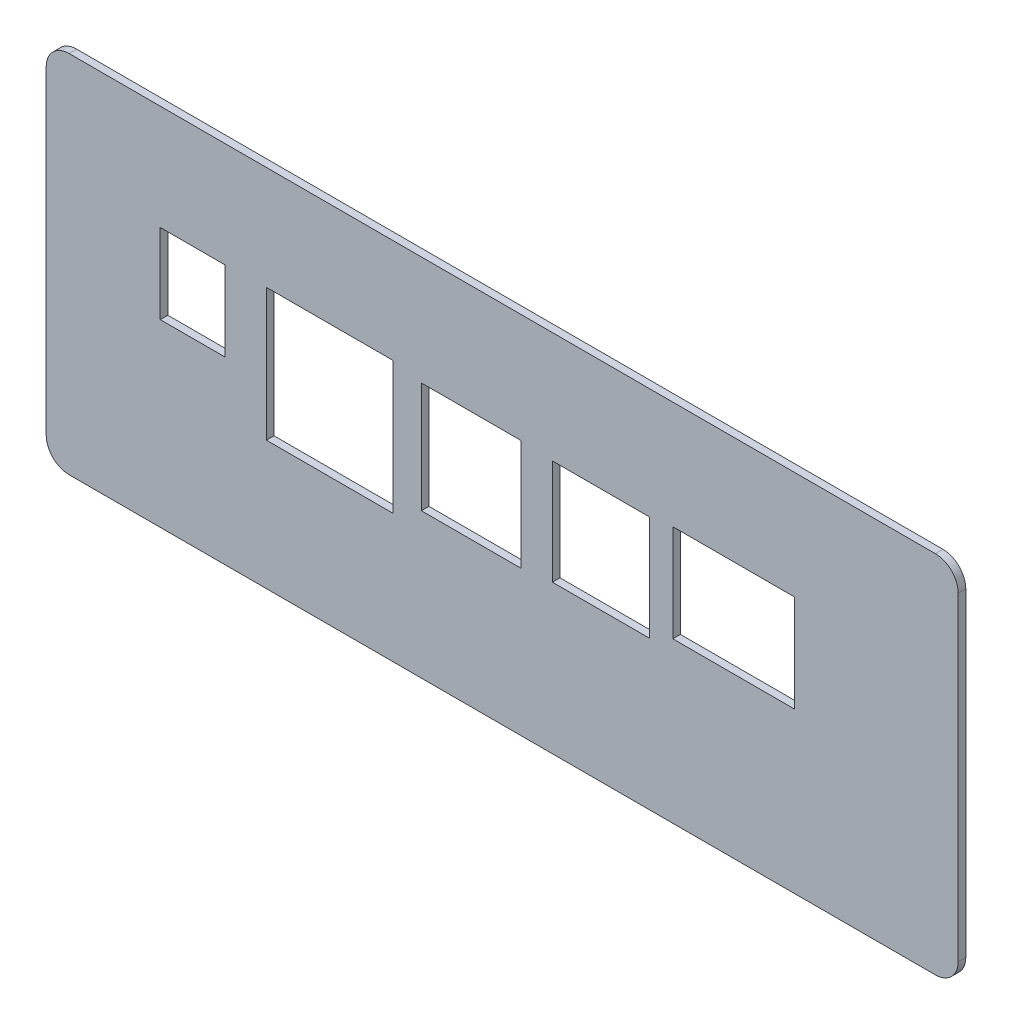
ISO-10303-21;
HEADER;
FILE_DESCRIPTION(('STEP AP214'),'2;1');
FILE_NAME('part.step','',(''),(''),'','','');
FILE_SCHEMA(('AUTOMOTIVE_DESIGN { 1 0 10303 214 1 1 1 1 }'));
ENDSEC;
DATA;
#1=APPLICATION_CONTEXT('core data for automotive mechanical design processes');
#2=APPLICATION_PROTOCOL_DEFINITION('international standard','automotive_design',2000,#1);
#3=PRODUCT_CONTEXT('',#1,'mechanical');
#4=PRODUCT('Part','Part','',(#3));
#5=PRODUCT_RELATED_PRODUCT_CATEGORY('part','',(#4));
#6=PRODUCT_DEFINITION_FORMATION('','',#4);
#7=PRODUCT_DEFINITION_CONTEXT('part definition',#1,'design');
#8=PRODUCT_DEFINITION('design','',#6,#7);
#9=PRODUCT_DEFINITION_SHAPE('','',#8);
#10=(LENGTH_UNIT() NAMED_UNIT(*) SI_UNIT(.MILLI.,.METRE.));
#11=(NAMED_UNIT(*) PLANE_ANGLE_UNIT() SI_UNIT($,.RADIAN.));
#12=(NAMED_UNIT(*) SI_UNIT($,.STERADIAN.) SOLID_ANGLE_UNIT());
#13=UNCERTAINTY_MEASURE_WITH_UNIT(LENGTH_MEASURE(1.E-05),#10,'distance_accuracy_value','');
#14=(GEOMETRIC_REPRESENTATION_CONTEXT(3) GLOBAL_UNCERTAINTY_ASSIGNED_CONTEXT((#13)) GLOBAL_UNIT_ASSIGNED_CONTEXT((#10,
#11,#12)) REPRESENTATION_CONTEXT('',''));
#15=CARTESIAN_POINT('',(0.,0.,0.));
#16=DIRECTION('',(0.,0.,1.));
#17=DIRECTION('',(1.,0.,0.));
#18=AXIS2_PLACEMENT_3D('',#15,#16,#17);
#19=CARTESIAN_POINT('',(-51.9401445531972,-20.8055695293981,1.));
#20=DIRECTION('',(0.,0.,1.));
#21=DIRECTION('',(1.,0.,0.));
#22=AXIS2_PLACEMENT_3D('',#19,#20,#21);
#23=PLANE('',#22);
#24=CARTESIAN_POINT('',(-51.9401445531972,-20.8055695293981,1.));
#25=DIRECTION('',(0.,0.,1.));
#26=DIRECTION('',(1.,0.,0.));
#27=AXIS2_PLACEMENT_3D('',#24,#25,#26);
#28=CIRCLE('',#27,3.);
#29=CARTESIAN_POINT('',(-54.9401445531972,-20.8055695293981,1.));
#30=VERTEX_POINT('',#29);
#31=CARTESIAN_POINT('',(-51.9401445531972,-23.8055695293981,1.));
#32=VERTEX_POINT('',#31);
#33=EDGE_CURVE('E380',#30,#32,#28,.T.);
#34=ORIENTED_EDGE('',*,*,#33,.T.);
#35=DIRECTION('',(1.,0.,0.));
#36=VECTOR('',#35,1.);
#37=CARTESIAN_POINT('',(-51.9401445531972,-23.8055695293981,1.));
#38=LINE('',#37,#36);
#39=CARTESIAN_POINT('',(62.0598554468028,-23.8055695293981,1.));
#40=VERTEX_POINT('',#39);
#41=EDGE_CURVE('E383',#32,#40,#38,.T.);
#42=ORIENTED_EDGE('',*,*,#41,.T.);
#43=CARTESIAN_POINT('',(62.0598554468028,-20.8055695293981,1.));
#44=DIRECTION('',(0.,0.,1.));
#45=DIRECTION('',(1.,0.,0.));
#46=AXIS2_PLACEMENT_3D('',#43,#44,#45);
#47=CIRCLE('',#46,3.);
#48=CARTESIAN_POINT('',(65.0598554468028,-20.8055695293981,1.));
#49=VERTEX_POINT('',#48);
#50=EDGE_CURVE('E386',#40,#49,#47,.T.);
#51=ORIENTED_EDGE('',*,*,#50,.T.);
#52=DIRECTION('',(0.,1.,0.));
#53=VECTOR('',#52,1.);
#54=CARTESIAN_POINT('',(65.0598554468028,-20.8055695293981,1.));
#55=LINE('',#54,#53);
#56=CARTESIAN_POINT('',(65.0598554468028,21.1944304706019,1.));
#57=VERTEX_POINT('',#56);
#58=EDGE_CURVE('E388',#49,#57,#55,.T.);
#59=ORIENTED_EDGE('',*,*,#58,.T.);
#60=CARTESIAN_POINT('',(62.0598554468028,21.1944304706019,1.));
#61=DIRECTION('',(0.,0.,1.));
#62=DIRECTION('',(1.,0.,0.));
#63=AXIS2_PLACEMENT_3D('',#60,#61,#62);
#64=CIRCLE('',#63,3.);
#65=CARTESIAN_POINT('',(62.0598554468028,24.1944304706019,1.));
#66=VERTEX_POINT('',#65);
#67=EDGE_CURVE('E390',#57,#66,#64,.T.);
#68=ORIENTED_EDGE('',*,*,#67,.T.);
#69=DIRECTION('',(-1.,0.,0.));
#70=VECTOR('',#69,1.);
#71=CARTESIAN_POINT('',(62.0598554468028,24.1944304706019,1.));
#72=LINE('',#71,#70);
#73=CARTESIAN_POINT('',(-51.9401445531972,24.1944304706019,1.));
#74=VERTEX_POINT('',#73);
#75=EDGE_CURVE('E392',#66,#74,#72,.T.);
#76=ORIENTED_EDGE('',*,*,#75,.T.);
#77=CARTESIAN_POINT('',(-51.9401445531972,21.1944304706019,1.));
#78=DIRECTION('',(0.,0.,1.));
#79=DIRECTION('',(1.,0.,0.));
#80=AXIS2_PLACEMENT_3D('',#77,#78,#79);
#81=CIRCLE('',#80,3.);
#82=CARTESIAN_POINT('',(-54.9401445531972,21.1944304706019,1.));
#83=VERTEX_POINT('',#82);
#84=EDGE_CURVE('E394',#74,#83,#81,.T.);
#85=ORIENTED_EDGE('',*,*,#84,.T.);
#86=DIRECTION('',(0.,-1.,0.));
#87=VECTOR('',#86,1.);
#88=CARTESIAN_POINT('',(-54.9401445531972,21.1944304706019,1.));
#89=LINE('',#88,#87);
#90=EDGE_CURVE('E396',#83,#30,#89,.T.);
#91=ORIENTED_EDGE('',*,*,#90,.T.);
#92=EDGE_LOOP('',(#34,#42,#51,#59,#68,#76,#85,#91));
#93=FACE_BOUND('',#92,.T.);
#94=DIRECTION('',(1.,0.,0.));
#95=VECTOR('',#94,1.);
#96=CARTESIAN_POINT('',(-5.58234423291933,-4.72872628174269,1.));
#97=LINE('',#96,#95);
#98=CARTESIAN_POINT('',(-5.58234423291933,-4.72872628174269,1.));
#99=VERTEX_POINT('',#98);
#100=CARTESIAN_POINT('',(7.51913348173285,-4.72872628174269,1.));
#101=VERTEX_POINT('',#100);
#102=EDGE_CURVE('E351',#99,#101,#97,.T.);
#103=ORIENTED_EDGE('',*,*,#102,.F.);
#104=DIRECTION('',(0.,-1.,0.));
#105=VECTOR('',#104,1.);
#106=CARTESIAN_POINT('',(-5.58234423291933,9.82946846077716,1.));
#107=LINE('',#106,#105);
#108=CARTESIAN_POINT('',(-5.58234423291933,9.82946846077716,1.));
#109=VERTEX_POINT('',#108);
#110=EDGE_CURVE('E349',#109,#99,#107,.T.);
#111=ORIENTED_EDGE('',*,*,#110,.F.);
#112=DIRECTION('',(-1.,0.,0.));
#113=VECTOR('',#112,1.);
#114=CARTESIAN_POINT('',(7.51913348173285,9.82946846077716,1.));
#115=LINE('',#114,#113);
#116=CARTESIAN_POINT('',(7.51913348173285,9.82946846077716,1.));
#117=VERTEX_POINT('',#116);
#118=EDGE_CURVE('E357',#117,#109,#115,.T.);
#119=ORIENTED_EDGE('',*,*,#118,.F.);
#120=DIRECTION('',(0.,1.,0.));
#121=VECTOR('',#120,1.);
#122=CARTESIAN_POINT('',(7.51913348173285,-4.72872628174269,1.));
#123=LINE('',#122,#121);
#124=EDGE_CURVE('E354',#101,#117,#123,.T.);
#125=ORIENTED_EDGE('',*,*,#124,.F.);
#126=EDGE_LOOP('',(#103,#111,#119,#125));
#127=FACE_BOUND('',#126,.T.);
#128=DIRECTION('',(0.,1.,0.));
#129=VECTOR('',#128,1.);
#130=CARTESIAN_POINT('',(-31.4401445531972,-0.130569529398064,1.));
#131=LINE('',#130,#129);
#132=CARTESIAN_POINT('',(-31.4401445531972,-0.130569529398064,1.));
#133=VERTEX_POINT('',#132);
#134=CARTESIAN_POINT('',(-31.4401445531972,10.3694304706019,1.));
#135=VERTEX_POINT('',#134);
#136=EDGE_CURVE('E320',#133,#135,#131,.T.);
#137=ORIENTED_EDGE('',*,*,#136,.F.);
#138=DIRECTION('',(1.,0.,0.));
#139=VECTOR('',#138,1.);
#140=CARTESIAN_POINT('',(-39.9401445531972,-0.130569529398064,1.));
#141=LINE('',#140,#139);
#142=CARTESIAN_POINT('',(-39.9401445531972,-0.130569529398064,1.));
#143=VERTEX_POINT('',#142);
#144=EDGE_CURVE('E318',#143,#133,#141,.T.);
#145=ORIENTED_EDGE('',*,*,#144,.F.);
#146=DIRECTION('',(0.,-1.,0.));
#147=VECTOR('',#146,1.);
#148=CARTESIAN_POINT('',(-39.9401445531972,10.3694304706019,1.));
#149=LINE('',#148,#147);
#150=CARTESIAN_POINT('',(-39.9401445531972,10.3694304706019,1.));
#151=VERTEX_POINT('',#150);
#152=EDGE_CURVE('E326',#151,#143,#149,.T.);
#153=ORIENTED_EDGE('',*,*,#152,.F.);
#154=DIRECTION('',(-1.,0.,0.));
#155=VECTOR('',#154,1.);
#156=CARTESIAN_POINT('',(-31.4401445531972,10.3694304706019,1.));
#157=LINE('',#156,#155);
#158=EDGE_CURVE('E323',#135,#151,#157,.T.);
#159=ORIENTED_EDGE('',*,*,#158,.F.);
#160=EDGE_LOOP('',(#137,#145,#153,#159));
#161=FACE_BOUND('',#160,.T.);
#162=DIRECTION('',(1.,0.,0.));
#163=VECTOR('',#162,1.);
#164=CARTESIAN_POINT('',(-25.9690040468462,-6.88508743177806,1.));
#165=LINE('',#164,#163);
#166=CARTESIAN_POINT('',(-25.9690040468462,-6.88508743177806,1.));
#167=VERTEX_POINT('',#166);
#168=CARTESIAN_POINT('',(-9.29014455319717,-6.88508743177806,1.));
#169=VERTEX_POINT('',#168);
#170=EDGE_CURVE('E289',#167,#169,#165,.T.);
#171=ORIENTED_EDGE('',*,*,#170,.F.);
#172=DIRECTION('',(0.,-1.,0.));
#173=VECTOR('',#172,1.);
#174=CARTESIAN_POINT('',(-25.9690040468462,10.5332304706019,1.));
#175=LINE('',#174,#173);
#176=CARTESIAN_POINT('',(-25.9690040468462,10.5332304706019,1.));
#177=VERTEX_POINT('',#176);
#178=EDGE_CURVE('E287',#177,#167,#175,.T.);
#179=ORIENTED_EDGE('',*,*,#178,.F.);
#180=DIRECTION('',(-1.,0.,0.));
#181=VECTOR('',#180,1.);
#182=CARTESIAN_POINT('',(-9.29014455319717,10.5332304706019,1.));
#183=LINE('',#182,#181);
#184=CARTESIAN_POINT('',(-9.29014455319717,10.5332304706019,1.));
#185=VERTEX_POINT('',#184);
#186=EDGE_CURVE('E295',#185,#177,#183,.T.);
#187=ORIENTED_EDGE('',*,*,#186,.F.);
#188=DIRECTION('',(0.,1.,0.));
#189=VECTOR('',#188,1.);
#190=CARTESIAN_POINT('',(-9.29014455319717,-6.88508743177806,1.));
#191=LINE('',#190,#189);
#192=EDGE_CURVE('E292',#169,#185,#191,.T.);
#193=ORIENTED_EDGE('',*,*,#192,.F.);
#194=EDGE_LOOP('',(#171,#179,#187,#193));
#195=FACE_BOUND('',#194,.T.);
#196=DIRECTION('',(1.,0.,0.));
#197=VECTOR('',#196,1.);
#198=CARTESIAN_POINT('',(27.5098555623345,-2.78056952939806,1.));
#199=LINE('',#198,#197);
#200=CARTESIAN_POINT('',(27.5098555623345,-2.78056952939806,1.));
#201=VERTEX_POINT('',#200);
#202=CARTESIAN_POINT('',(43.5050701768028,-2.78056952939806,1.));
#203=VERTEX_POINT('',#202);
#204=EDGE_CURVE('E258',#201,#203,#199,.T.);
#205=ORIENTED_EDGE('',*,*,#204,.F.);
#206=DIRECTION('',(0.,-1.,0.));
#207=VECTOR('',#206,1.);
#208=CARTESIAN_POINT('',(27.5098555623345,9.99323047060194,1.));
#209=LINE('',#208,#207);
#210=CARTESIAN_POINT('',(27.5098555623345,9.99323047060194,1.));
#211=VERTEX_POINT('',#210);
#212=EDGE_CURVE('E256',#211,#201,#209,.T.);
#213=ORIENTED_EDGE('',*,*,#212,.F.);
#214=DIRECTION('',(-1.,0.,0.));
#215=VECTOR('',#214,1.);
#216=CARTESIAN_POINT('',(43.5050701768028,9.99323047060194,1.));
#217=LINE('',#216,#215);
#218=CARTESIAN_POINT('',(43.5050701768028,9.99323047060194,1.));
#219=VERTEX_POINT('',#218);
#220=EDGE_CURVE('E264',#219,#211,#217,.T.);
#221=ORIENTED_EDGE('',*,*,#220,.F.);
#222=DIRECTION('',(0.,1.,0.));
#223=VECTOR('',#222,1.);
#224=CARTESIAN_POINT('',(43.5050701768028,-2.78056952939806,1.));
#225=LINE('',#224,#223);
#226=EDGE_CURVE('E261',#203,#219,#225,.T.);
#227=ORIENTED_EDGE('',*,*,#226,.F.);
#228=EDGE_LOOP('',(#205,#213,#221,#227));
#229=FACE_BOUND('',#228,.T.);
#230=DIRECTION('',(1.,0.,0.));
#231=VECTOR('',#230,1.);
#232=CARTESIAN_POINT('',(11.6598554468024,-4.25056952939696,1.));
#233=LINE('',#232,#231);
#234=CARTESIAN_POINT('',(11.6598554468024,-4.25056952939696,1.));
#235=VERTEX_POINT('',#234);
#236=CARTESIAN_POINT('',(24.4598554468021,-4.25056952939696,1.));
#237=VERTEX_POINT('',#236);
#238=EDGE_CURVE('E228',#235,#237,#233,.T.);
#239=ORIENTED_EDGE('',*,*,#238,.F.);
#240=DIRECTION('',(0.,-1.,0.));
#241=VECTOR('',#240,1.);
#242=CARTESIAN_POINT('',(11.6598554468024,9.56943047065491,1.));
#243=LINE('',#242,#241);
#244=CARTESIAN_POINT('',(11.6598554468024,9.56943047065491,1.));
#245=VERTEX_POINT('',#244);
#246=EDGE_CURVE('E220',#245,#235,#243,.T.);
#247=ORIENTED_EDGE('',*,*,#246,.F.);
#248=DIRECTION('',(-1.,0.,0.));
#249=VECTOR('',#248,1.);
#250=CARTESIAN_POINT('',(24.4598554468021,9.56943047065491,1.));
#251=LINE('',#250,#249);
#252=CARTESIAN_POINT('',(24.4598554468021,9.56943047065491,1.));
#253=VERTEX_POINT('',#252);
#254=EDGE_CURVE('E242',#253,#245,#251,.T.);
#255=ORIENTED_EDGE('',*,*,#254,.F.);
#256=DIRECTION('',(0.,1.,0.));
#257=VECTOR('',#256,1.);
#258=CARTESIAN_POINT('',(24.4598554468021,-4.25056952939696,1.));
#259=LINE('',#258,#257);
#260=EDGE_CURVE('E240',#237,#253,#259,.T.);
#261=ORIENTED_EDGE('',*,*,#260,.F.);
#262=EDGE_LOOP('',(#239,#247,#255,#261));
#263=FACE_BOUND('',#262,.T.);
#264=ADVANCED_FACE('F35',(#93,#127,#161,#195,#229,#263),#23,.T.);
#265=CARTESIAN_POINT('',(-51.9401445531972,-20.8055695293981,0.));
#266=DIRECTION('',(0.,0.,1.));
#267=DIRECTION('',(1.,0.,0.));
#268=AXIS2_PLACEMENT_3D('',#265,#266,#267);
#269=PLANE('',#268);
#270=DIRECTION('',(0.,-1.,0.));
#271=VECTOR('',#270,1.);
#272=CARTESIAN_POINT('',(27.5098555623345,9.99323047060194,0.));
#273=LINE('',#272,#271);
#274=CARTESIAN_POINT('',(27.5098555623345,9.99323047060194,0.));
#275=VERTEX_POINT('',#274);
#276=CARTESIAN_POINT('',(27.5098555623345,-2.78056952939806,0.));
#277=VERTEX_POINT('',#276);
#278=EDGE_CURVE('E236',#275,#277,#273,.T.);
#279=ORIENTED_EDGE('',*,*,#278,.T.);
#280=DIRECTION('',(1.,0.,0.));
#281=VECTOR('',#280,1.);
#282=CARTESIAN_POINT('',(27.5098555623345,-2.78056952939806,0.));
#283=LINE('',#282,#281);
#284=CARTESIAN_POINT('',(43.5050701768028,-2.78056952939806,0.));
#285=VERTEX_POINT('',#284);
#286=EDGE_CURVE('E269',#277,#285,#283,.T.);
#287=ORIENTED_EDGE('',*,*,#286,.T.);
#288=DIRECTION('',(0.,1.,0.));
#289=VECTOR('',#288,1.);
#290=CARTESIAN_POINT('',(43.5050701768028,-2.78056952939806,0.));
#291=LINE('',#290,#289);
#292=CARTESIAN_POINT('',(43.5050701768028,9.99323047060194,0.));
#293=VERTEX_POINT('',#292);
#294=EDGE_CURVE('E272',#285,#293,#291,.T.);
#295=ORIENTED_EDGE('',*,*,#294,.T.);
#296=DIRECTION('',(-1.,0.,0.));
#297=VECTOR('',#296,1.);
#298=CARTESIAN_POINT('',(43.5050701768028,9.99323047060194,0.));
#299=LINE('',#298,#297);
#300=EDGE_CURVE('E259',#293,#275,#299,.T.);
#301=ORIENTED_EDGE('',*,*,#300,.T.);
#302=EDGE_LOOP('',(#279,#287,#295,#301));
#303=FACE_BOUND('',#302,.T.);
#304=DIRECTION('',(1.,0.,0.));
#305=VECTOR('',#304,1.);
#306=CARTESIAN_POINT('',(-39.9401445531972,-0.130569529398064,0.));
#307=LINE('',#306,#305);
#308=CARTESIAN_POINT('',(-39.9401445531972,-0.130569529398064,0.));
#309=VERTEX_POINT('',#308);
#310=CARTESIAN_POINT('',(-31.4401445531972,-0.130569529398064,0.));
#311=VERTEX_POINT('',#310);
#312=EDGE_CURVE('E317',#309,#311,#307,.T.);
#313=ORIENTED_EDGE('',*,*,#312,.T.);
#314=DIRECTION('',(0.,1.,0.));
#315=VECTOR('',#314,1.);
#316=CARTESIAN_POINT('',(-31.4401445531972,-0.130569529398064,0.));
#317=LINE('',#316,#315);
#318=CARTESIAN_POINT('',(-31.4401445531972,10.3694304706019,0.));
#319=VERTEX_POINT('',#318);
#320=EDGE_CURVE('E331',#311,#319,#317,.T.);
#321=ORIENTED_EDGE('',*,*,#320,.T.);
#322=DIRECTION('',(-1.,0.,0.));
#323=VECTOR('',#322,1.);
#324=CARTESIAN_POINT('',(-31.4401445531972,10.3694304706019,0.));
#325=LINE('',#324,#323);
#326=CARTESIAN_POINT('',(-39.9401445531972,10.3694304706019,0.));
#327=VERTEX_POINT('',#326);
#328=EDGE_CURVE('E334',#319,#327,#325,.T.);
#329=ORIENTED_EDGE('',*,*,#328,.T.);
#330=DIRECTION('',(0.,-1.,0.));
#331=VECTOR('',#330,1.);
#332=CARTESIAN_POINT('',(-39.9401445531972,10.3694304706019,0.));
#333=LINE('',#332,#331);
#334=EDGE_CURVE('E321',#327,#309,#333,.T.);
#335=ORIENTED_EDGE('',*,*,#334,.T.);
#336=EDGE_LOOP('',(#313,#321,#329,#335));
#337=FACE_BOUND('',#336,.T.);
#338=CARTESIAN_POINT('',(-51.9401445531972,-20.8055695293981,0.));
#339=DIRECTION('',(0.,0.,1.));
#340=DIRECTION('',(1.,0.,0.));
#341=AXIS2_PLACEMENT_3D('',#338,#339,#340);
#342=CIRCLE('',#341,3.);
#343=CARTESIAN_POINT('',(-54.9401445531972,-20.8055695293981,0.));
#344=VERTEX_POINT('',#343);
#345=CARTESIAN_POINT('',(-51.9401445531972,-23.8055695293981,0.));
#346=VERTEX_POINT('',#345);
#347=EDGE_CURVE('E379',#344,#346,#342,.T.);
#348=ORIENTED_EDGE('',*,*,#347,.F.);
#349=DIRECTION('',(0.,-1.,0.));
#350=VECTOR('',#349,1.);
#351=CARTESIAN_POINT('',(-54.9401445531972,0.194430470601938,0.));
#352=LINE('',#351,#350);
#353=CARTESIAN_POINT('',(-54.9401445531972,21.1944304706019,0.));
#354=VERTEX_POINT('',#353);
#355=EDGE_CURVE('E384',#354,#344,#352,.T.);
#356=ORIENTED_EDGE('',*,*,#355,.F.);
#357=CARTESIAN_POINT('',(-51.9401445531972,21.1944304706019,0.));
#358=DIRECTION('',(0.,0.,1.));
#359=DIRECTION('',(1.,0.,0.));
#360=AXIS2_PLACEMENT_3D('',#357,#358,#359);
#361=CIRCLE('',#360,3.);
#362=CARTESIAN_POINT('',(-51.9401445531972,24.1944304706019,0.));
#363=VERTEX_POINT('',#362);
#364=EDGE_CURVE('E412',#363,#354,#361,.T.);
#365=ORIENTED_EDGE('',*,*,#364,.F.);
#366=DIRECTION('',(-1.,0.,0.));
#367=VECTOR('',#366,1.);
#368=CARTESIAN_POINT('',(62.0598554468028,24.1944304706019,0.));
#369=LINE('',#368,#367);
#370=CARTESIAN_POINT('',(62.0598554468028,24.1944304706019,0.));
#371=VERTEX_POINT('',#370);
#372=EDGE_CURVE('E410',#371,#363,#369,.T.);
#373=ORIENTED_EDGE('',*,*,#372,.F.);
#374=CARTESIAN_POINT('',(62.0598554468028,21.1944304706019,0.));
#375=DIRECTION('',(0.,0.,1.));
#376=DIRECTION('',(1.,0.,0.));
#377=AXIS2_PLACEMENT_3D('',#374,#375,#376);
#378=CIRCLE('',#377,3.);
#379=CARTESIAN_POINT('',(65.0598554468028,21.1944304706019,0.));
#380=VERTEX_POINT('',#379);
#381=EDGE_CURVE('E408',#380,#371,#378,.T.);
#382=ORIENTED_EDGE('',*,*,#381,.F.);
#383=DIRECTION('',(0.,1.,0.));
#384=VECTOR('',#383,1.);
#385=CARTESIAN_POINT('',(65.0598554468031,0.194430470601938,0.));
#386=LINE('',#385,#384);
#387=CARTESIAN_POINT('',(65.0598554468028,-20.8055695293981,0.));
#388=VERTEX_POINT('',#387);
#389=EDGE_CURVE('E406',#388,#380,#386,.T.);
#390=ORIENTED_EDGE('',*,*,#389,.F.);
#391=CARTESIAN_POINT('',(62.0598554468028,-20.8055695293981,0.));
#392=DIRECTION('',(0.,0.,1.));
#393=DIRECTION('',(1.,0.,0.));
#394=AXIS2_PLACEMENT_3D('',#391,#392,#393);
#395=CIRCLE('',#394,3.);
#396=CARTESIAN_POINT('',(62.0598554468028,-23.8055695293981,0.));
#397=VERTEX_POINT('',#396);
#398=EDGE_CURVE('E403',#397,#388,#395,.T.);
#399=ORIENTED_EDGE('',*,*,#398,.F.);
#400=DIRECTION('',(1.,0.,0.));
#401=VECTOR('',#400,1.);
#402=CARTESIAN_POINT('',(-51.9401445531972,-23.8055695293981,0.));
#403=LINE('',#402,#401);
#404=EDGE_CURVE('E401',#346,#397,#403,.T.);
#405=ORIENTED_EDGE('',*,*,#404,.F.);
#406=EDGE_LOOP('',(#348,#356,#365,#373,#382,#390,#399,#405));
#407=FACE_BOUND('',#406,.T.);
#408=DIRECTION('',(0.,-1.,0.));
#409=VECTOR('',#408,1.);
#410=CARTESIAN_POINT('',(-5.58234423291933,9.82946846077716,0.));
#411=LINE('',#410,#409);
#412=CARTESIAN_POINT('',(-5.58234423291933,9.82946846077716,0.));
#413=VERTEX_POINT('',#412);
#414=CARTESIAN_POINT('',(-5.58234423291933,-4.72872628174269,0.));
#415=VERTEX_POINT('',#414);
#416=EDGE_CURVE('E348',#413,#415,#411,.T.);
#417=ORIENTED_EDGE('',*,*,#416,.T.);
#418=DIRECTION('',(1.,0.,0.));
#419=VECTOR('',#418,1.);
#420=CARTESIAN_POINT('',(-5.58234423291933,-4.72872628174269,0.));
#421=LINE('',#420,#419);
#422=CARTESIAN_POINT('',(7.51913348173285,-4.72872628174269,0.));
#423=VERTEX_POINT('',#422);
#424=EDGE_CURVE('E362',#415,#423,#421,.T.);
#425=ORIENTED_EDGE('',*,*,#424,.T.);
#426=DIRECTION('',(0.,1.,0.));
#427=VECTOR('',#426,1.);
#428=CARTESIAN_POINT('',(7.51913348173285,-4.72872628174269,0.));
#429=LINE('',#428,#427);
#430=CARTESIAN_POINT('',(7.51913348173285,9.82946846077716,0.));
#431=VERTEX_POINT('',#430);
#432=EDGE_CURVE('E365',#423,#431,#429,.T.);
#433=ORIENTED_EDGE('',*,*,#432,.T.);
#434=DIRECTION('',(-1.,0.,0.));
#435=VECTOR('',#434,1.);
#436=CARTESIAN_POINT('',(7.51913348173285,9.82946846077716,0.));
#437=LINE('',#436,#435);
#438=EDGE_CURVE('E352',#431,#413,#437,.T.);
#439=ORIENTED_EDGE('',*,*,#438,.T.);
#440=EDGE_LOOP('',(#417,#425,#433,#439));
#441=FACE_BOUND('',#440,.T.);
#442=DIRECTION('',(0.,-1.,0.));
#443=VECTOR('',#442,1.);
#444=CARTESIAN_POINT('',(-25.9690040468462,10.5332304706019,0.));
#445=LINE('',#444,#443);
#446=CARTESIAN_POINT('',(-25.9690040468462,10.5332304706019,0.));
#447=VERTEX_POINT('',#446);
#448=CARTESIAN_POINT('',(-25.9690040468462,-6.88508743177806,0.));
#449=VERTEX_POINT('',#448);
#450=EDGE_CURVE('E286',#447,#449,#445,.T.);
#451=ORIENTED_EDGE('',*,*,#450,.T.);
#452=DIRECTION('',(1.,0.,0.));
#453=VECTOR('',#452,1.);
#454=CARTESIAN_POINT('',(-25.9690040468462,-6.88508743177806,0.));
#455=LINE('',#454,#453);
#456=CARTESIAN_POINT('',(-9.29014455319717,-6.88508743177806,0.));
#457=VERTEX_POINT('',#456);
#458=EDGE_CURVE('E300',#449,#457,#455,.T.);
#459=ORIENTED_EDGE('',*,*,#458,.T.);
#460=DIRECTION('',(0.,1.,0.));
#461=VECTOR('',#460,1.);
#462=CARTESIAN_POINT('',(-9.29014455319717,-6.88508743177806,0.));
#463=LINE('',#462,#461);
#464=CARTESIAN_POINT('',(-9.29014455319717,10.5332304706019,0.));
#465=VERTEX_POINT('',#464);
#466=EDGE_CURVE('E303',#457,#465,#463,.T.);
#467=ORIENTED_EDGE('',*,*,#466,.T.);
#468=DIRECTION('',(-1.,0.,0.));
#469=VECTOR('',#468,1.);
#470=CARTESIAN_POINT('',(-9.29014455319717,10.5332304706019,0.));
#471=LINE('',#470,#469);
#472=EDGE_CURVE('E290',#465,#447,#471,.T.);
#473=ORIENTED_EDGE('',*,*,#472,.T.);
#474=EDGE_LOOP('',(#451,#459,#467,#473));
#475=FACE_BOUND('',#474,.T.);
#476=DIRECTION('',(0.,-1.,0.));
#477=VECTOR('',#476,1.);
#478=CARTESIAN_POINT('',(11.6598554468024,9.56943047065491,0.));
#479=LINE('',#478,#477);
#480=CARTESIAN_POINT('',(11.6598554468024,9.56943047065491,0.));
#481=VERTEX_POINT('',#480);
#482=CARTESIAN_POINT('',(11.6598554468024,-4.25056952939696,0.));
#483=VERTEX_POINT('',#482);
#484=EDGE_CURVE('E58',#481,#483,#479,.T.);
#485=ORIENTED_EDGE('',*,*,#484,.T.);
#486=DIRECTION('',(1.,0.,0.));
#487=VECTOR('',#486,1.);
#488=CARTESIAN_POINT('',(11.6598554468024,-4.25056952939696,0.));
#489=LINE('',#488,#487);
#490=CARTESIAN_POINT('',(24.4598554468021,-4.25056952939696,0.));
#491=VERTEX_POINT('',#490);
#492=EDGE_CURVE('E235',#483,#491,#489,.T.);
#493=ORIENTED_EDGE('',*,*,#492,.T.);
#494=DIRECTION('',(0.,1.,0.));
#495=VECTOR('',#494,1.);
#496=CARTESIAN_POINT('',(24.4598554468021,-4.25056952939696,0.));
#497=LINE('',#496,#495);
#498=CARTESIAN_POINT('',(24.4598554468021,9.56943047065491,0.));
#499=VERTEX_POINT('',#498);
#500=EDGE_CURVE('E248',#491,#499,#497,.T.);
#501=ORIENTED_EDGE('',*,*,#500,.T.);
#502=DIRECTION('',(-1.,0.,0.));
#503=VECTOR('',#502,1.);
#504=CARTESIAN_POINT('',(24.4598554468021,9.56943047065491,0.));
#505=LINE('',#504,#503);
#506=EDGE_CURVE('E229',#499,#481,#505,.T.);
#507=ORIENTED_EDGE('',*,*,#506,.T.);
#508=EDGE_LOOP('',(#485,#493,#501,#507));
#509=FACE_BOUND('',#508,.T.);
#510=ADVANCED_FACE('F442',(#303,#337,#407,#441,#475,#509),#269,.F.);
#511=CARTESIAN_POINT('',(-51.9401445531972,-20.8055695293981,1.));
#512=DIRECTION('',(0.,0.,-1.));
#513=DIRECTION('',(-1.,0.,0.));
#514=AXIS2_PLACEMENT_3D('',#511,#512,#513);
#515=CYLINDRICAL_SURFACE('',#514,3.);
#516=ORIENTED_EDGE('',*,*,#347,.T.);
#517=DIRECTION('',(0.,0.,-1.));
#518=VECTOR('',#517,1.);
#519=CARTESIAN_POINT('',(-51.9401445531972,-23.8055695293981,1.));
#520=LINE('',#519,#518);
#521=EDGE_CURVE('E11',#32,#346,#520,.T.);
#522=ORIENTED_EDGE('',*,*,#521,.F.);
#523=ORIENTED_EDGE('',*,*,#33,.F.);
#524=DIRECTION('',(0.,0.,-1.));
#525=VECTOR('',#524,1.);
#526=CARTESIAN_POINT('',(-54.9401445531972,-20.8055695293981,1.));
#527=LINE('',#526,#525);
#528=EDGE_CURVE('E398',#30,#344,#527,.T.);
#529=ORIENTED_EDGE('',*,*,#528,.T.);
#530=EDGE_LOOP('',(#516,#522,#523,#529));
#531=FACE_BOUND('',#530,.T.);
#532=ADVANCED_FACE('F37',(#531),#515,.T.);
#533=CARTESIAN_POINT('',(-51.9401445531972,-23.8055695293981,1.));
#534=DIRECTION('',(0.,1.,0.));
#535=DIRECTION('',(0.,0.,1.));
#536=AXIS2_PLACEMENT_3D('',#533,#534,#535);
#537=PLANE('',#536);
#538=ORIENTED_EDGE('',*,*,#404,.T.);
#539=DIRECTION('',(0.,0.,-1.));
#540=VECTOR('',#539,1.);
#541=CARTESIAN_POINT('',(62.0598554468028,-23.8055695293981,1.));
#542=LINE('',#541,#540);
#543=EDGE_CURVE('E43',#40,#397,#542,.T.);
#544=ORIENTED_EDGE('',*,*,#543,.F.);
#545=ORIENTED_EDGE('',*,*,#41,.F.);
#546=ORIENTED_EDGE('',*,*,#521,.T.);
#547=EDGE_LOOP('',(#538,#544,#545,#546));
#548=FACE_BOUND('',#547,.T.);
#549=ADVANCED_FACE('F460',(#548),#537,.F.);
#550=CARTESIAN_POINT('',(62.0598554468028,-20.8055695293981,1.));
#551=DIRECTION('',(0.,0.,-1.));
#552=DIRECTION('',(-1.,0.,0.));
#553=AXIS2_PLACEMENT_3D('',#550,#551,#552);
#554=CYLINDRICAL_SURFACE('',#553,3.);
#555=ORIENTED_EDGE('',*,*,#398,.T.);
#556=DIRECTION('',(0.,0.,-1.));
#557=VECTOR('',#556,1.);
#558=CARTESIAN_POINT('',(65.0598554468028,-20.8055695293981,1.));
#559=LINE('',#558,#557);
#560=EDGE_CURVE('E430',#49,#388,#559,.T.);
#561=ORIENTED_EDGE('',*,*,#560,.F.);
#562=ORIENTED_EDGE('',*,*,#50,.F.);
#563=ORIENTED_EDGE('',*,*,#543,.T.);
#564=EDGE_LOOP('',(#555,#561,#562,#563));
#565=FACE_BOUND('',#564,.T.);
#566=ADVANCED_FACE('F437',(#565),#554,.T.);
#567=CARTESIAN_POINT('',(65.0598554468031,0.194430470601938,1.));
#568=DIRECTION('',(-1.,0.,0.));
#569=DIRECTION('',(0.,-1.,0.));
#570=AXIS2_PLACEMENT_3D('',#567,#568,#569);
#571=PLANE('',#570);
#572=ORIENTED_EDGE('',*,*,#389,.T.);
#573=DIRECTION('',(0.,0.,-1.));
#574=VECTOR('',#573,1.);
#575=CARTESIAN_POINT('',(65.0598554468028,21.1944304706019,1.));
#576=LINE('',#575,#574);
#577=EDGE_CURVE('E427',#57,#380,#576,.T.);
#578=ORIENTED_EDGE('',*,*,#577,.F.);
#579=ORIENTED_EDGE('',*,*,#58,.F.);
#580=ORIENTED_EDGE('',*,*,#560,.T.);
#581=EDGE_LOOP('',(#572,#578,#579,#580));
#582=FACE_BOUND('',#581,.T.);
#583=ADVANCED_FACE('F448',(#582),#571,.F.);
#584=CARTESIAN_POINT('',(62.0598554468028,21.1944304706019,1.));
#585=DIRECTION('',(0.,0.,-1.));
#586=DIRECTION('',(-1.,0.,0.));
#587=AXIS2_PLACEMENT_3D('',#584,#585,#586);
#588=CYLINDRICAL_SURFACE('',#587,3.);
#589=ORIENTED_EDGE('',*,*,#381,.T.);
#590=DIRECTION('',(0.,0.,-1.));
#591=VECTOR('',#590,1.);
#592=CARTESIAN_POINT('',(62.0598554468028,24.1944304706019,1.));
#593=LINE('',#592,#591);
#594=EDGE_CURVE('E424',#66,#371,#593,.T.);
#595=ORIENTED_EDGE('',*,*,#594,.F.);
#596=ORIENTED_EDGE('',*,*,#67,.F.);
#597=ORIENTED_EDGE('',*,*,#577,.T.);
#598=EDGE_LOOP('',(#589,#595,#596,#597));
#599=FACE_BOUND('',#598,.T.);
#600=ADVANCED_FACE('F452',(#599),#588,.T.);
#601=CARTESIAN_POINT('',(62.0598554468028,24.1944304706019,1.));
#602=DIRECTION('',(0.,-1.,0.));
#603=DIRECTION('',(0.,0.,-1.));
#604=AXIS2_PLACEMENT_3D('',#601,#602,#603);
#605=PLANE('',#604);
#606=ORIENTED_EDGE('',*,*,#372,.T.);
#607=DIRECTION('',(0.,0.,-1.));
#608=VECTOR('',#607,1.);
#609=CARTESIAN_POINT('',(-51.9401445531972,24.1944304706019,1.));
#610=LINE('',#609,#608);
#611=EDGE_CURVE('E421',#74,#363,#610,.T.);
#612=ORIENTED_EDGE('',*,*,#611,.F.);
#613=ORIENTED_EDGE('',*,*,#75,.F.);
#614=ORIENTED_EDGE('',*,*,#594,.T.);
#615=EDGE_LOOP('',(#606,#612,#613,#614));
#616=FACE_BOUND('',#615,.T.);
#617=ADVANCED_FACE('F481',(#616),#605,.F.);
#618=CARTESIAN_POINT('',(-51.9401445531972,21.1944304706019,1.));
#619=DIRECTION('',(0.,0.,-1.));
#620=DIRECTION('',(-1.,0.,0.));
#621=AXIS2_PLACEMENT_3D('',#618,#619,#620);
#622=CYLINDRICAL_SURFACE('',#621,3.);
#623=ORIENTED_EDGE('',*,*,#364,.T.);
#624=DIRECTION('',(0.,0.,-1.));
#625=VECTOR('',#624,1.);
#626=CARTESIAN_POINT('',(-54.9401445531972,21.1944304706019,1.));
#627=LINE('',#626,#625);
#628=EDGE_CURVE('E418',#83,#354,#627,.T.);
#629=ORIENTED_EDGE('',*,*,#628,.F.);
#630=ORIENTED_EDGE('',*,*,#84,.F.);
#631=ORIENTED_EDGE('',*,*,#611,.T.);
#632=EDGE_LOOP('',(#623,#629,#630,#631));
#633=FACE_BOUND('',#632,.T.);
#634=ADVANCED_FACE('F467',(#633),#622,.T.);
#635=CARTESIAN_POINT('',(-54.9401445531972,0.194430470601938,1.));
#636=DIRECTION('',(1.,0.,0.));
#637=DIRECTION('',(0.,1.,0.));
#638=AXIS2_PLACEMENT_3D('',#635,#636,#637);
#639=PLANE('',#638);
#640=ORIENTED_EDGE('',*,*,#355,.T.);
#641=ORIENTED_EDGE('',*,*,#528,.F.);
#642=ORIENTED_EDGE('',*,*,#90,.F.);
#643=ORIENTED_EDGE('',*,*,#628,.T.);
#644=EDGE_LOOP('',(#640,#641,#642,#643));
#645=FACE_BOUND('',#644,.T.);
#646=ADVANCED_FACE('F470',(#645),#639,.F.);
#647=CARTESIAN_POINT('',(-5.58234423291933,9.82946846077716,1.));
#648=DIRECTION('',(1.,0.,0.));
#649=DIRECTION('',(0.,0.,-1.));
#650=AXIS2_PLACEMENT_3D('',#647,#648,#649);
#651=PLANE('',#650);
#652=ORIENTED_EDGE('',*,*,#416,.F.);
#653=DIRECTION('',(0.,0.,-1.));
#654=VECTOR('',#653,1.);
#655=CARTESIAN_POINT('',(-5.58234423291933,9.82946846077716,1.));
#656=LINE('',#655,#654);
#657=EDGE_CURVE('E359',#109,#413,#656,.T.);
#658=ORIENTED_EDGE('',*,*,#657,.F.);
#659=ORIENTED_EDGE('',*,*,#110,.T.);
#660=DIRECTION('',(0.,0.,-1.));
#661=VECTOR('',#660,1.);
#662=CARTESIAN_POINT('',(-5.58234423291933,-4.72872628174269,1.));
#663=LINE('',#662,#661);
#664=EDGE_CURVE('E376',#99,#415,#663,.T.);
#665=ORIENTED_EDGE('',*,*,#664,.T.);
#666=EDGE_LOOP('',(#652,#658,#659,#665));
#667=FACE_BOUND('',#666,.T.);
#668=ADVANCED_FACE('F472',(#667),#651,.T.);
#669=CARTESIAN_POINT('',(-5.58234423291933,-4.72872628174269,1.));
#670=DIRECTION('',(0.,1.,0.));
#671=DIRECTION('',(0.,0.,1.));
#672=AXIS2_PLACEMENT_3D('',#669,#670,#671);
#673=PLANE('',#672);
#674=ORIENTED_EDGE('',*,*,#424,.F.);
#675=ORIENTED_EDGE('',*,*,#664,.F.);
#676=ORIENTED_EDGE('',*,*,#102,.T.);
#677=DIRECTION('',(0.,0.,-1.));
#678=VECTOR('',#677,1.);
#679=CARTESIAN_POINT('',(7.51913348173285,-4.72872628174269,1.));
#680=LINE('',#679,#678);
#681=EDGE_CURVE('E374',#101,#423,#680,.T.);
#682=ORIENTED_EDGE('',*,*,#681,.T.);
#683=EDGE_LOOP('',(#674,#675,#676,#682));
#684=FACE_BOUND('',#683,.T.);
#685=ADVANCED_FACE('F478',(#684),#673,.T.);
#686=CARTESIAN_POINT('',(7.51913348173285,-4.72872628174269,1.));
#687=DIRECTION('',(-1.,0.,0.));
#688=DIRECTION('',(0.,0.,1.));
#689=AXIS2_PLACEMENT_3D('',#686,#687,#688);
#690=PLANE('',#689);
#691=ORIENTED_EDGE('',*,*,#432,.F.);
#692=ORIENTED_EDGE('',*,*,#681,.F.);
#693=ORIENTED_EDGE('',*,*,#124,.T.);
#694=DIRECTION('',(0.,0.,-1.));
#695=VECTOR('',#694,1.);
#696=CARTESIAN_POINT('',(7.51913348173285,9.82946846077716,1.));
#697=LINE('',#696,#695);
#698=EDGE_CURVE('E372',#117,#431,#697,.T.);
#699=ORIENTED_EDGE('',*,*,#698,.T.);
#700=EDGE_LOOP('',(#691,#692,#693,#699));
#701=FACE_BOUND('',#700,.T.);
#702=ADVANCED_FACE('F493',(#701),#690,.T.);
#703=CARTESIAN_POINT('',(7.51913348173285,9.82946846077716,1.));
#704=DIRECTION('',(0.,-1.,0.));
#705=DIRECTION('',(0.,0.,-1.));
#706=AXIS2_PLACEMENT_3D('',#703,#704,#705);
#707=PLANE('',#706);
#708=ORIENTED_EDGE('',*,*,#438,.F.);
#709=ORIENTED_EDGE('',*,*,#698,.F.);
#710=ORIENTED_EDGE('',*,*,#118,.T.);
#711=ORIENTED_EDGE('',*,*,#657,.T.);
#712=EDGE_LOOP('',(#708,#709,#710,#711));
#713=FACE_BOUND('',#712,.T.);
#714=ADVANCED_FACE('F497',(#713),#707,.T.);
#715=CARTESIAN_POINT('',(-39.9401445531972,-0.130569529398064,1.));
#716=DIRECTION('',(0.,1.,0.));
#717=DIRECTION('',(0.,0.,1.));
#718=AXIS2_PLACEMENT_3D('',#715,#716,#717);
#719=PLANE('',#718);
#720=ORIENTED_EDGE('',*,*,#312,.F.);
#721=DIRECTION('',(0.,0.,-1.));
#722=VECTOR('',#721,1.);
#723=CARTESIAN_POINT('',(-39.9401445531972,-0.130569529398064,1.));
#724=LINE('',#723,#722);
#725=EDGE_CURVE('E328',#143,#309,#724,.T.);
#726=ORIENTED_EDGE('',*,*,#725,.F.);
#727=ORIENTED_EDGE('',*,*,#144,.T.);
#728=DIRECTION('',(0.,0.,-1.));
#729=VECTOR('',#728,1.);
#730=CARTESIAN_POINT('',(-31.4401445531972,-0.130569529398064,1.));
#731=LINE('',#730,#729);
#732=EDGE_CURVE('E345',#133,#311,#731,.T.);
#733=ORIENTED_EDGE('',*,*,#732,.T.);
#734=EDGE_LOOP('',(#720,#726,#727,#733));
#735=FACE_BOUND('',#734,.T.);
#736=ADVANCED_FACE('F501',(#735),#719,.T.);
#737=CARTESIAN_POINT('',(-31.4401445531972,-0.130569529398064,1.));
#738=DIRECTION('',(-1.,0.,0.));
#739=DIRECTION('',(0.,0.,1.));
#740=AXIS2_PLACEMENT_3D('',#737,#738,#739);
#741=PLANE('',#740);
#742=ORIENTED_EDGE('',*,*,#320,.F.);
#743=ORIENTED_EDGE('',*,*,#732,.F.);
#744=ORIENTED_EDGE('',*,*,#136,.T.);
#745=DIRECTION('',(0.,0.,-1.));
#746=VECTOR('',#745,1.);
#747=CARTESIAN_POINT('',(-31.4401445531972,10.3694304706019,1.));
#748=LINE('',#747,#746);
#749=EDGE_CURVE('E343',#135,#319,#748,.T.);
#750=ORIENTED_EDGE('',*,*,#749,.T.);
#751=EDGE_LOOP('',(#742,#743,#744,#750));
#752=FACE_BOUND('',#751,.T.);
#753=ADVANCED_FACE('F505',(#752),#741,.T.);
#754=CARTESIAN_POINT('',(-31.4401445531972,10.3694304706019,1.));
#755=DIRECTION('',(0.,-1.,0.));
#756=DIRECTION('',(0.,0.,-1.));
#757=AXIS2_PLACEMENT_3D('',#754,#755,#756);
#758=PLANE('',#757);
#759=ORIENTED_EDGE('',*,*,#328,.F.);
#760=ORIENTED_EDGE('',*,*,#749,.F.);
#761=ORIENTED_EDGE('',*,*,#158,.T.);
#762=DIRECTION('',(0.,0.,-1.));
#763=VECTOR('',#762,1.);
#764=CARTESIAN_POINT('',(-39.9401445531972,10.3694304706019,1.));
#765=LINE('',#764,#763);
#766=EDGE_CURVE('E341',#151,#327,#765,.T.);
#767=ORIENTED_EDGE('',*,*,#766,.T.);
#768=EDGE_LOOP('',(#759,#760,#761,#767));
#769=FACE_BOUND('',#768,.T.);
#770=ADVANCED_FACE('F509',(#769),#758,.T.);
#771=CARTESIAN_POINT('',(-39.9401445531972,10.3694304706019,1.));
#772=DIRECTION('',(1.,0.,0.));
#773=DIRECTION('',(0.,0.,-1.));
#774=AXIS2_PLACEMENT_3D('',#771,#772,#773);
#775=PLANE('',#774);
#776=ORIENTED_EDGE('',*,*,#334,.F.);
#777=ORIENTED_EDGE('',*,*,#766,.F.);
#778=ORIENTED_EDGE('',*,*,#152,.T.);
#779=ORIENTED_EDGE('',*,*,#725,.T.);
#780=EDGE_LOOP('',(#776,#777,#778,#779));
#781=FACE_BOUND('',#780,.T.);
#782=ADVANCED_FACE('F513',(#781),#775,.T.);
#783=CARTESIAN_POINT('',(-25.9690040468462,10.5332304706019,1.));
#784=DIRECTION('',(1.,0.,0.));
#785=DIRECTION('',(0.,0.,-1.));
#786=AXIS2_PLACEMENT_3D('',#783,#784,#785);
#787=PLANE('',#786);
#788=ORIENTED_EDGE('',*,*,#450,.F.);
#789=DIRECTION('',(0.,0.,-1.));
#790=VECTOR('',#789,1.);
#791=CARTESIAN_POINT('',(-25.9690040468462,10.5332304706019,1.));
#792=LINE('',#791,#790);
#793=EDGE_CURVE('E297',#177,#447,#792,.T.);
#794=ORIENTED_EDGE('',*,*,#793,.F.);
#795=ORIENTED_EDGE('',*,*,#178,.T.);
#796=DIRECTION('',(0.,0.,-1.));
#797=VECTOR('',#796,1.);
#798=CARTESIAN_POINT('',(-25.9690040468462,-6.88508743177806,1.));
#799=LINE('',#798,#797);
#800=EDGE_CURVE('E314',#167,#449,#799,.T.);
#801=ORIENTED_EDGE('',*,*,#800,.T.);
#802=EDGE_LOOP('',(#788,#794,#795,#801));
#803=FACE_BOUND('',#802,.T.);
#804=ADVANCED_FACE('F517',(#803),#787,.T.);
#805=CARTESIAN_POINT('',(-25.9690040468462,-6.88508743177806,1.));
#806=DIRECTION('',(0.,1.,0.));
#807=DIRECTION('',(0.,0.,1.));
#808=AXIS2_PLACEMENT_3D('',#805,#806,#807);
#809=PLANE('',#808);
#810=ORIENTED_EDGE('',*,*,#458,.F.);
#811=ORIENTED_EDGE('',*,*,#800,.F.);
#812=ORIENTED_EDGE('',*,*,#170,.T.);
#813=DIRECTION('',(0.,0.,-1.));
#814=VECTOR('',#813,1.);
#815=CARTESIAN_POINT('',(-9.29014455319717,-6.88508743177806,1.));
#816=LINE('',#815,#814);
#817=EDGE_CURVE('E312',#169,#457,#816,.T.);
#818=ORIENTED_EDGE('',*,*,#817,.T.);
#819=EDGE_LOOP('',(#810,#811,#812,#818));
#820=FACE_BOUND('',#819,.T.);
#821=ADVANCED_FACE('F521',(#820),#809,.T.);
#822=CARTESIAN_POINT('',(-9.29014455319717,-6.88508743177806,1.));
#823=DIRECTION('',(-1.,0.,0.));
#824=DIRECTION('',(0.,0.,1.));
#825=AXIS2_PLACEMENT_3D('',#822,#823,#824);
#826=PLANE('',#825);
#827=ORIENTED_EDGE('',*,*,#466,.F.);
#828=ORIENTED_EDGE('',*,*,#817,.F.);
#829=ORIENTED_EDGE('',*,*,#192,.T.);
#830=DIRECTION('',(0.,0.,-1.));
#831=VECTOR('',#830,1.);
#832=CARTESIAN_POINT('',(-9.29014455319717,10.5332304706019,1.));
#833=LINE('',#832,#831);
#834=EDGE_CURVE('E310',#185,#465,#833,.T.);
#835=ORIENTED_EDGE('',*,*,#834,.T.);
#836=EDGE_LOOP('',(#827,#828,#829,#835));
#837=FACE_BOUND('',#836,.T.);
#838=ADVANCED_FACE('F525',(#837),#826,.T.);
#839=CARTESIAN_POINT('',(-9.29014455319717,10.5332304706019,1.));
#840=DIRECTION('',(0.,-1.,0.));
#841=DIRECTION('',(0.,0.,-1.));
#842=AXIS2_PLACEMENT_3D('',#839,#840,#841);
#843=PLANE('',#842);
#844=ORIENTED_EDGE('',*,*,#472,.F.);
#845=ORIENTED_EDGE('',*,*,#834,.F.);
#846=ORIENTED_EDGE('',*,*,#186,.T.);
#847=ORIENTED_EDGE('',*,*,#793,.T.);
#848=EDGE_LOOP('',(#844,#845,#846,#847));
#849=FACE_BOUND('',#848,.T.);
#850=ADVANCED_FACE('F529',(#849),#843,.T.);
#851=CARTESIAN_POINT('',(27.5098555623345,9.99323047060194,1.));
#852=DIRECTION('',(1.,0.,0.));
#853=DIRECTION('',(0.,0.,-1.));
#854=AXIS2_PLACEMENT_3D('',#851,#852,#853);
#855=PLANE('',#854);
#856=ORIENTED_EDGE('',*,*,#278,.F.);
#857=DIRECTION('',(0.,0.,-1.));
#858=VECTOR('',#857,1.);
#859=CARTESIAN_POINT('',(27.5098555623345,9.99323047060194,1.));
#860=LINE('',#859,#858);
#861=EDGE_CURVE('E266',#211,#275,#860,.T.);
#862=ORIENTED_EDGE('',*,*,#861,.F.);
#863=ORIENTED_EDGE('',*,*,#212,.T.);
#864=DIRECTION('',(0.,0.,-1.));
#865=VECTOR('',#864,1.);
#866=CARTESIAN_POINT('',(27.5098555623345,-2.78056952939806,1.));
#867=LINE('',#866,#865);
#868=EDGE_CURVE('E283',#201,#277,#867,.T.);
#869=ORIENTED_EDGE('',*,*,#868,.T.);
#870=EDGE_LOOP('',(#856,#862,#863,#869));
#871=FACE_BOUND('',#870,.T.);
#872=ADVANCED_FACE('F533',(#871),#855,.T.);
#873=CARTESIAN_POINT('',(27.5098555623345,-2.78056952939806,1.));
#874=DIRECTION('',(0.,1.,0.));
#875=DIRECTION('',(0.,0.,1.));
#876=AXIS2_PLACEMENT_3D('',#873,#874,#875);
#877=PLANE('',#876);
#878=ORIENTED_EDGE('',*,*,#286,.F.);
#879=ORIENTED_EDGE('',*,*,#868,.F.);
#880=ORIENTED_EDGE('',*,*,#204,.T.);
#881=DIRECTION('',(0.,0.,-1.));
#882=VECTOR('',#881,1.);
#883=CARTESIAN_POINT('',(43.5050701768028,-2.78056952939806,1.));
#884=LINE('',#883,#882);
#885=EDGE_CURVE('E281',#203,#285,#884,.T.);
#886=ORIENTED_EDGE('',*,*,#885,.T.);
#887=EDGE_LOOP('',(#878,#879,#880,#886));
#888=FACE_BOUND('',#887,.T.);
#889=ADVANCED_FACE('F537',(#888),#877,.T.);
#890=CARTESIAN_POINT('',(43.5050701768028,-2.78056952939806,1.));
#891=DIRECTION('',(-1.,0.,0.));
#892=DIRECTION('',(0.,0.,1.));
#893=AXIS2_PLACEMENT_3D('',#890,#891,#892);
#894=PLANE('',#893);
#895=ORIENTED_EDGE('',*,*,#294,.F.);
#896=ORIENTED_EDGE('',*,*,#885,.F.);
#897=ORIENTED_EDGE('',*,*,#226,.T.);
#898=DIRECTION('',(0.,0.,-1.));
#899=VECTOR('',#898,1.);
#900=CARTESIAN_POINT('',(43.5050701768028,9.99323047060194,1.));
#901=LINE('',#900,#899);
#902=EDGE_CURVE('E279',#219,#293,#901,.T.);
#903=ORIENTED_EDGE('',*,*,#902,.T.);
#904=EDGE_LOOP('',(#895,#896,#897,#903));
#905=FACE_BOUND('',#904,.T.);
#906=ADVANCED_FACE('F541',(#905),#894,.T.);
#907=CARTESIAN_POINT('',(43.5050701768028,9.99323047060194,1.));
#908=DIRECTION('',(0.,-1.,0.));
#909=DIRECTION('',(0.,0.,-1.));
#910=AXIS2_PLACEMENT_3D('',#907,#908,#909);
#911=PLANE('',#910);
#912=ORIENTED_EDGE('',*,*,#300,.F.);
#913=ORIENTED_EDGE('',*,*,#902,.F.);
#914=ORIENTED_EDGE('',*,*,#220,.T.);
#915=ORIENTED_EDGE('',*,*,#861,.T.);
#916=EDGE_LOOP('',(#912,#913,#914,#915));
#917=FACE_BOUND('',#916,.T.);
#918=ADVANCED_FACE('F545',(#917),#911,.T.);
#919=CARTESIAN_POINT('',(11.6598554468024,9.56943047065491,1.));
#920=DIRECTION('',(1.,0.,0.));
#921=DIRECTION('',(0.,0.,-1.));
#922=AXIS2_PLACEMENT_3D('',#919,#920,#921);
#923=PLANE('',#922);
#924=ORIENTED_EDGE('',*,*,#484,.F.);
#925=DIRECTION('',(0.,0.,-1.));
#926=VECTOR('',#925,1.);
#927=CARTESIAN_POINT('',(11.6598554468024,9.56943047065491,1.));
#928=LINE('',#927,#926);
#929=EDGE_CURVE('E224',#245,#481,#928,.T.);
#930=ORIENTED_EDGE('',*,*,#929,.F.);
#931=ORIENTED_EDGE('',*,*,#246,.T.);
#932=DIRECTION('',(0.,0.,-1.));
#933=VECTOR('',#932,1.);
#934=CARTESIAN_POINT('',(11.6598554468024,-4.25056952939696,1.));
#935=LINE('',#934,#933);
#936=EDGE_CURVE('E223',#235,#483,#935,.T.);
#937=ORIENTED_EDGE('',*,*,#936,.T.);
#938=EDGE_LOOP('',(#924,#930,#931,#937));
#939=FACE_BOUND('',#938,.T.);
#940=ADVANCED_FACE('F222',(#939),#923,.T.);
#941=CARTESIAN_POINT('',(11.6598554468024,-4.25056952939696,1.));
#942=DIRECTION('',(0.,1.,0.));
#943=DIRECTION('',(0.,0.,1.));
#944=AXIS2_PLACEMENT_3D('',#941,#942,#943);
#945=PLANE('',#944);
#946=ORIENTED_EDGE('',*,*,#492,.F.);
#947=ORIENTED_EDGE('',*,*,#936,.F.);
#948=ORIENTED_EDGE('',*,*,#238,.T.);
#949=DIRECTION('',(0.,0.,-1.));
#950=VECTOR('',#949,1.);
#951=CARTESIAN_POINT('',(24.4598554468021,-4.25056952939696,1.));
#952=LINE('',#951,#950);
#953=EDGE_CURVE('E237',#237,#491,#952,.T.);
#954=ORIENTED_EDGE('',*,*,#953,.T.);
#955=EDGE_LOOP('',(#946,#947,#948,#954));
#956=FACE_BOUND('',#955,.T.);
#957=ADVANCED_FACE('F232',(#956),#945,.T.);
#958=CARTESIAN_POINT('',(24.4598554468021,-4.25056952939696,1.));
#959=DIRECTION('',(-1.,0.,0.));
#960=DIRECTION('',(0.,0.,1.));
#961=AXIS2_PLACEMENT_3D('',#958,#959,#960);
#962=PLANE('',#961);
#963=ORIENTED_EDGE('',*,*,#500,.F.);
#964=ORIENTED_EDGE('',*,*,#953,.F.);
#965=ORIENTED_EDGE('',*,*,#260,.T.);
#966=DIRECTION('',(0.,0.,-1.));
#967=VECTOR('',#966,1.);
#968=CARTESIAN_POINT('',(24.4598554468021,9.56943047065491,1.));
#969=LINE('',#968,#967);
#970=EDGE_CURVE('E50',#253,#499,#969,.T.);
#971=ORIENTED_EDGE('',*,*,#970,.T.);
#972=EDGE_LOOP('',(#963,#964,#965,#971));
#973=FACE_BOUND('',#972,.T.);
#974=ADVANCED_FACE('F554',(#973),#962,.T.);
#975=CARTESIAN_POINT('',(24.4598554468021,9.56943047065491,1.));
#976=DIRECTION('',(0.,-1.,0.));
#977=DIRECTION('',(0.,0.,-1.));
#978=AXIS2_PLACEMENT_3D('',#975,#976,#977);
#979=PLANE('',#978);
#980=ORIENTED_EDGE('',*,*,#506,.F.);
#981=ORIENTED_EDGE('',*,*,#970,.F.);
#982=ORIENTED_EDGE('',*,*,#254,.T.);
#983=ORIENTED_EDGE('',*,*,#929,.T.);
#984=EDGE_LOOP('',(#980,#981,#982,#983));
#985=FACE_BOUND('',#984,.T.);
#986=ADVANCED_FACE('F557',(#985),#979,.T.);
#987=CLOSED_SHELL('',(#264,#510,#532,#549,#566,#583,#600,#617,#634,#646,#668,#685,#702,#714,
#736,#753,#770,#782,#804,#821,#838,#850,#872,#889,#906,#918,#940,#957,#974,#986));
#988=MANIFOLD_SOLID_BREP('B2',#987);
#989=ADVANCED_BREP_SHAPE_REPRESENTATION('',(#18,#988),#14);
#990=SHAPE_DEFINITION_REPRESENTATION(#9,#989);
ENDSEC;
END-ISO-10303-21;
